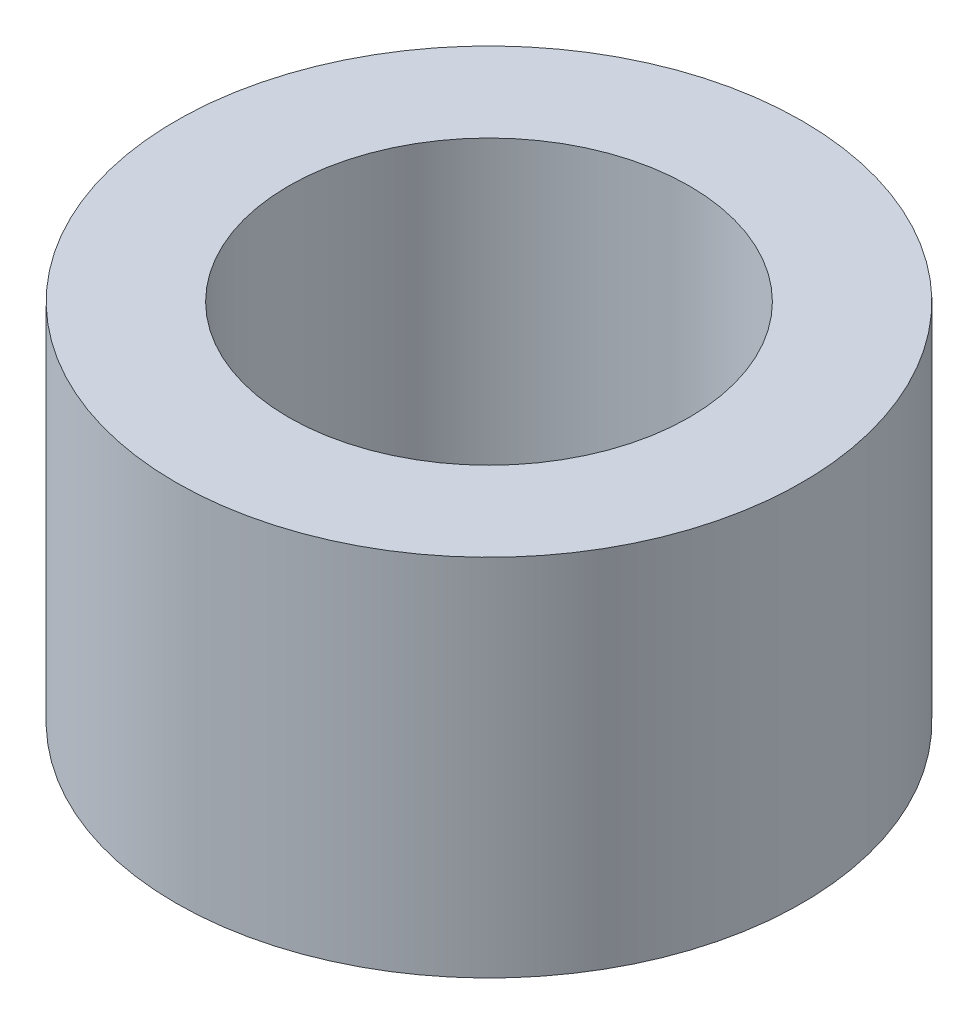
ISO-10303-21;
HEADER;
FILE_DESCRIPTION(('STEP AP214'),'2;1');
FILE_NAME('part.step','',(''),(''),'','','');
FILE_SCHEMA(('AUTOMOTIVE_DESIGN { 1 0 10303 214 1 1 1 1 }'));
ENDSEC;
DATA;
#1=APPLICATION_CONTEXT('core data for automotive mechanical design processes');
#2=APPLICATION_PROTOCOL_DEFINITION('international standard','automotive_design',2000,#1);
#3=PRODUCT_CONTEXT('',#1,'mechanical');
#4=PRODUCT('Part','Part','',(#3));
#5=PRODUCT_RELATED_PRODUCT_CATEGORY('part','',(#4));
#6=PRODUCT_DEFINITION_FORMATION('','',#4);
#7=PRODUCT_DEFINITION_CONTEXT('part definition',#1,'design');
#8=PRODUCT_DEFINITION('design','',#6,#7);
#9=PRODUCT_DEFINITION_SHAPE('','',#8);
#10=(LENGTH_UNIT() NAMED_UNIT(*) SI_UNIT(.MILLI.,.METRE.));
#11=(NAMED_UNIT(*) PLANE_ANGLE_UNIT() SI_UNIT($,.RADIAN.));
#12=(NAMED_UNIT(*) SI_UNIT($,.STERADIAN.) SOLID_ANGLE_UNIT());
#13=UNCERTAINTY_MEASURE_WITH_UNIT(LENGTH_MEASURE(1.E-05),#10,'distance_accuracy_value','');
#14=(GEOMETRIC_REPRESENTATION_CONTEXT(3) GLOBAL_UNCERTAINTY_ASSIGNED_CONTEXT((#13)) GLOBAL_UNIT_ASSIGNED_CONTEXT((#10,
#11,#12)) REPRESENTATION_CONTEXT('',''));
#15=CARTESIAN_POINT('',(0.,0.,0.));
#16=DIRECTION('',(0.,0.,1.));
#17=DIRECTION('',(1.,0.,0.));
#18=AXIS2_PLACEMENT_3D('',#15,#16,#17);
#19=CARTESIAN_POINT('',(0.,3.,0.));
#20=DIRECTION('',(0.,1.,0.));
#21=DIRECTION('',(0.,0.,1.));
#22=AXIS2_PLACEMENT_3D('',#19,#20,#21);
#23=PLANE('',#22);
#24=CARTESIAN_POINT('',(0.,3.,0.));
#25=DIRECTION('',(0.,1.,0.));
#26=DIRECTION('',(0.,0.,1.));
#27=AXIS2_PLACEMENT_3D('',#24,#25,#26);
#28=CIRCLE('',#27,2.578125);
#29=CARTESIAN_POINT('',(0.,3.,2.578125));
#30=VERTEX_POINT('',#29);
#31=EDGE_CURVE('E10',#30,#30,#28,.T.);
#32=ORIENTED_EDGE('',*,*,#31,.T.);
#33=EDGE_LOOP('',(#32));
#34=FACE_BOUND('',#33,.T.);
#35=CARTESIAN_POINT('',(0.,3.,0.));
#36=DIRECTION('',(0.,1.,0.));
#37=DIRECTION('',(0.,0.,1.));
#38=AXIS2_PLACEMENT_3D('',#35,#36,#37);
#39=CIRCLE('',#38,1.65);
#40=CARTESIAN_POINT('',(0.,3.,1.65));
#41=VERTEX_POINT('',#40);
#42=EDGE_CURVE('E43',#41,#41,#39,.T.);
#43=ORIENTED_EDGE('',*,*,#42,.F.);
#44=EDGE_LOOP('',(#43));
#45=FACE_BOUND('',#44,.T.);
#46=ADVANCED_FACE('F32',(#34,#45),#23,.T.);
#47=CARTESIAN_POINT('',(0.,0.,0.));
#48=DIRECTION('',(0.,1.,0.));
#49=DIRECTION('',(0.,0.,1.));
#50=AXIS2_PLACEMENT_3D('',#47,#48,#49);
#51=PLANE('',#50);
#52=CARTESIAN_POINT('',(0.,0.,0.));
#53=DIRECTION('',(0.,1.,0.));
#54=DIRECTION('',(0.,0.,1.));
#55=AXIS2_PLACEMENT_3D('',#52,#53,#54);
#56=CIRCLE('',#55,2.578125);
#57=CARTESIAN_POINT('',(0.,0.,2.578125));
#58=VERTEX_POINT('',#57);
#59=EDGE_CURVE('E36',#58,#58,#56,.T.);
#60=ORIENTED_EDGE('',*,*,#59,.F.);
#61=EDGE_LOOP('',(#60));
#62=FACE_BOUND('',#61,.T.);
#63=CARTESIAN_POINT('',(0.,0.,0.));
#64=DIRECTION('',(0.,1.,0.));
#65=DIRECTION('',(0.,0.,1.));
#66=AXIS2_PLACEMENT_3D('',#63,#64,#65);
#67=CIRCLE('',#66,1.65);
#68=CARTESIAN_POINT('',(0.,0.,1.65));
#69=VERTEX_POINT('',#68);
#70=EDGE_CURVE('E45',#69,#69,#67,.T.);
#71=ORIENTED_EDGE('',*,*,#70,.T.);
#72=EDGE_LOOP('',(#71));
#73=FACE_BOUND('',#72,.T.);
#74=ADVANCED_FACE('F55',(#62,#73),#51,.F.);
#75=CARTESIAN_POINT('',(0.,3.,0.));
#76=DIRECTION('',(0.,-1.,0.));
#77=DIRECTION('',(0.,0.,-1.));
#78=AXIS2_PLACEMENT_3D('',#75,#76,#77);
#79=CYLINDRICAL_SURFACE('',#78,2.578125);
#80=ORIENTED_EDGE('',*,*,#31,.F.);
#81=EDGE_LOOP('',(#80));
#82=FACE_BOUND('',#81,.T.);
#83=ORIENTED_EDGE('',*,*,#59,.T.);
#84=EDGE_LOOP('',(#83));
#85=FACE_BOUND('',#84,.T.);
#86=ADVANCED_FACE('F34',(#82,#85),#79,.T.);
#87=CARTESIAN_POINT('',(0.,3.,0.));
#88=DIRECTION('',(0.,-1.,0.));
#89=DIRECTION('',(0.,0.,-1.));
#90=AXIS2_PLACEMENT_3D('',#87,#88,#89);
#91=CYLINDRICAL_SURFACE('',#90,1.65);
#92=ORIENTED_EDGE('',*,*,#42,.T.);
#93=EDGE_LOOP('',(#92));
#94=FACE_BOUND('',#93,.T.);
#95=ORIENTED_EDGE('',*,*,#70,.F.);
#96=EDGE_LOOP('',(#95));
#97=FACE_BOUND('',#96,.T.);
#98=ADVANCED_FACE('F51',(#94,#97),#91,.F.);
#99=CLOSED_SHELL('',(#46,#74,#86,#98));
#100=MANIFOLD_SOLID_BREP('B2',#99);
#101=ADVANCED_BREP_SHAPE_REPRESENTATION('',(#18,#100),#14);
#102=SHAPE_DEFINITION_REPRESENTATION(#9,#101);
ENDSEC;
END-ISO-10303-21;
